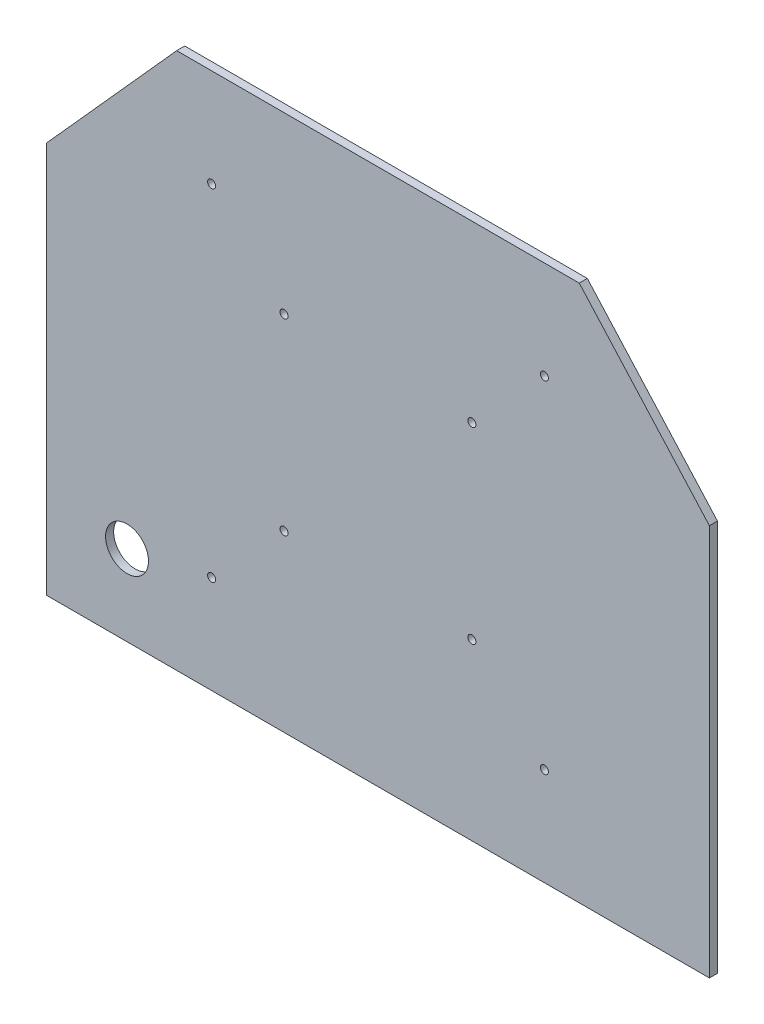
ISO-10303-21;
HEADER;
FILE_DESCRIPTION(('STEP AP214'),'2;1');
FILE_NAME('part.step','',(''),(''),'','','');
FILE_SCHEMA(('AUTOMOTIVE_DESIGN { 1 0 10303 214 1 1 1 1 }'));
ENDSEC;
DATA;
#1=APPLICATION_CONTEXT('core data for automotive mechanical design processes');
#2=APPLICATION_PROTOCOL_DEFINITION('international standard','automotive_design',2000,#1);
#3=PRODUCT_CONTEXT('',#1,'mechanical');
#4=PRODUCT('Part','Part','',(#3));
#5=PRODUCT_RELATED_PRODUCT_CATEGORY('part','',(#4));
#6=PRODUCT_DEFINITION_FORMATION('','',#4);
#7=PRODUCT_DEFINITION_CONTEXT('part definition',#1,'design');
#8=PRODUCT_DEFINITION('design','',#6,#7);
#9=PRODUCT_DEFINITION_SHAPE('','',#8);
#10=(LENGTH_UNIT() NAMED_UNIT(*) SI_UNIT(.MILLI.,.METRE.));
#11=(NAMED_UNIT(*) PLANE_ANGLE_UNIT() SI_UNIT($,.RADIAN.));
#12=(NAMED_UNIT(*) SI_UNIT($,.STERADIAN.) SOLID_ANGLE_UNIT());
#13=UNCERTAINTY_MEASURE_WITH_UNIT(LENGTH_MEASURE(1.E-05),#10,'distance_accuracy_value','');
#14=(GEOMETRIC_REPRESENTATION_CONTEXT(3) GLOBAL_UNCERTAINTY_ASSIGNED_CONTEXT((#13)) GLOBAL_UNIT_ASSIGNED_CONTEXT((#10,
#11,#12)) REPRESENTATION_CONTEXT('',''));
#15=CARTESIAN_POINT('',(0.,0.,0.));
#16=DIRECTION('',(0.,0.,1.));
#17=DIRECTION('',(1.,0.,0.));
#18=AXIS2_PLACEMENT_3D('',#15,#16,#17);
#19=CARTESIAN_POINT('',(280.2,0.,3.));
#20=DIRECTION('',(0.,1.,0.));
#21=DIRECTION('',(0.,0.,1.));
#22=AXIS2_PLACEMENT_3D('',#19,#20,#21);
#23=PLANE('',#22);
#24=DIRECTION('',(1.,0.,0.));
#25=VECTOR('',#24,1.);
#26=CARTESIAN_POINT('',(280.2,0.,0.));
#27=LINE('',#26,#25);
#28=CARTESIAN_POINT('',(16.5999999999984,2.22738494315422E-13,0.));
#29=VERTEX_POINT('',#28);
#30=CARTESIAN_POINT('',(263.600000000002,0.,0.));
#31=VERTEX_POINT('',#30);
#32=EDGE_CURVE('E97',#29,#31,#27,.T.);
#33=ORIENTED_EDGE('',*,*,#32,.T.);
#34=DIRECTION('',(0.,0.,-1.));
#35=VECTOR('',#34,1.);
#36=CARTESIAN_POINT('',(263.600000000002,2.22738494315422E-13,3.));
#37=LINE('',#36,#35);
#38=CARTESIAN_POINT('',(263.600000000002,2.22738494315422E-13,3.));
#39=VERTEX_POINT('',#38);
#40=EDGE_CURVE('E47',#39,#31,#37,.T.);
#41=ORIENTED_EDGE('',*,*,#40,.F.);
#42=DIRECTION('',(1.,0.,0.));
#43=VECTOR('',#42,1.);
#44=CARTESIAN_POINT('',(280.2,0.,3.));
#45=LINE('',#44,#43);
#46=CARTESIAN_POINT('',(16.5999999999984,2.22738494315422E-13,3.));
#47=VERTEX_POINT('',#46);
#48=EDGE_CURVE('E95',#47,#39,#45,.T.);
#49=ORIENTED_EDGE('',*,*,#48,.F.);
#50=DIRECTION('',(0.,0.,-1.));
#51=VECTOR('',#50,1.);
#52=CARTESIAN_POINT('',(16.5999999999984,2.22738494315422E-13,3.));
#53=LINE('',#52,#51);
#54=EDGE_CURVE('E140',#47,#29,#53,.T.);
#55=ORIENTED_EDGE('',*,*,#54,.T.);
#56=EDGE_LOOP('',(#33,#41,#49,#55));
#57=FACE_BOUND('',#56,.T.);
#58=ADVANCED_FACE('F33',(#57),#23,.F.);
#59=CARTESIAN_POINT('',(215.1,200.,3.));
#60=DIRECTION('',(-0.744288047549977,-0.667858744252288,0.));
#61=DIRECTION('',(0.667858744252288,-0.744288047549977,0.));
#62=AXIS2_PLACEMENT_3D('',#59,#60,#61);
#63=PLANE('',#62);
#64=DIRECTION('',(-0.667858744252288,0.744288047549977,0.));
#65=VECTOR('',#64,1.);
#66=CARTESIAN_POINT('',(215.1,200.,3.));
#67=LINE('',#66,#65);
#68=CARTESIAN_POINT('',(263.600000000002,145.949692780336,3.));
#69=VERTEX_POINT('',#68);
#70=CARTESIAN_POINT('',(215.1,200.,3.));
#71=VERTEX_POINT('',#70);
#72=EDGE_CURVE('E103',#69,#71,#67,.T.);
#73=ORIENTED_EDGE('',*,*,#72,.F.);
#74=DIRECTION('',(0.,0.,-1.));
#75=VECTOR('',#74,1.);
#76=CARTESIAN_POINT('',(263.600000000002,145.949692780336,3.));
#77=LINE('',#76,#75);
#78=CARTESIAN_POINT('',(263.600000000002,145.949692780336,0.));
#79=VERTEX_POINT('',#78);
#80=EDGE_CURVE('E85',#69,#79,#77,.T.);
#81=ORIENTED_EDGE('',*,*,#80,.T.);
#82=DIRECTION('',(-0.667858744252288,0.744288047549977,0.));
#83=VECTOR('',#82,1.);
#84=CARTESIAN_POINT('',(215.1,200.,0.));
#85=LINE('',#84,#83);
#86=CARTESIAN_POINT('',(215.1,200.,0.));
#87=VERTEX_POINT('',#86);
#88=EDGE_CURVE('E119',#79,#87,#85,.T.);
#89=ORIENTED_EDGE('',*,*,#88,.T.);
#90=DIRECTION('',(0.,0.,-1.));
#91=VECTOR('',#90,1.);
#92=CARTESIAN_POINT('',(215.1,200.,3.));
#93=LINE('',#92,#91);
#94=EDGE_CURVE('E40',#71,#87,#93,.T.);
#95=ORIENTED_EDGE('',*,*,#94,.F.);
#96=EDGE_LOOP('',(#73,#81,#89,#95));
#97=FACE_BOUND('',#96,.T.);
#98=ADVANCED_FACE('F138',(#97),#63,.F.);
#99=CARTESIAN_POINT('',(65.1,200.,3.));
#100=DIRECTION('',(0.,-1.,0.));
#101=DIRECTION('',(0.,0.,-1.));
#102=AXIS2_PLACEMENT_3D('',#99,#100,#101);
#103=PLANE('',#102);
#104=DIRECTION('',(-1.,0.,0.));
#105=VECTOR('',#104,1.);
#106=CARTESIAN_POINT('',(65.1,200.,0.));
#107=LINE('',#106,#105);
#108=CARTESIAN_POINT('',(65.1,200.,0.));
#109=VERTEX_POINT('',#108);
#110=EDGE_CURVE('E109',#87,#109,#107,.T.);
#111=ORIENTED_EDGE('',*,*,#110,.T.);
#112=DIRECTION('',(0.,0.,-1.));
#113=VECTOR('',#112,1.);
#114=CARTESIAN_POINT('',(65.1,200.,3.));
#115=LINE('',#114,#113);
#116=CARTESIAN_POINT('',(65.1,200.,3.));
#117=VERTEX_POINT('',#116);
#118=EDGE_CURVE('E117',#117,#109,#115,.T.);
#119=ORIENTED_EDGE('',*,*,#118,.F.);
#120=DIRECTION('',(-1.,0.,0.));
#121=VECTOR('',#120,1.);
#122=CARTESIAN_POINT('',(65.1,200.,3.));
#123=LINE('',#122,#121);
#124=EDGE_CURVE('E106',#71,#117,#123,.T.);
#125=ORIENTED_EDGE('',*,*,#124,.F.);
#126=ORIENTED_EDGE('',*,*,#94,.T.);
#127=EDGE_LOOP('',(#111,#119,#125,#126));
#128=FACE_BOUND('',#127,.T.);
#129=ADVANCED_FACE('F128',(#128),#103,.F.);
#130=CARTESIAN_POINT('',(0.,127.45,3.));
#131=DIRECTION('',(0.744288047549977,-0.667858744252288,0.));
#132=DIRECTION('',(0.667858744252288,0.744288047549977,0.));
#133=AXIS2_PLACEMENT_3D('',#130,#131,#132);
#134=PLANE('',#133);
#135=DIRECTION('',(-0.667858744252288,-0.744288047549977,0.));
#136=VECTOR('',#135,1.);
#137=CARTESIAN_POINT('',(0.,127.45,0.));
#138=LINE('',#137,#136);
#139=CARTESIAN_POINT('',(16.5999999999984,145.949692780336,0.));
#140=VERTEX_POINT('',#139);
#141=EDGE_CURVE('E104',#109,#140,#138,.T.);
#142=ORIENTED_EDGE('',*,*,#141,.T.);
#143=DIRECTION('',(0.,0.,1.));
#144=VECTOR('',#143,1.);
#145=CARTESIAN_POINT('',(16.5999999999984,145.949692780336,3.));
#146=LINE('',#145,#144);
#147=CARTESIAN_POINT('',(16.5999999999984,145.949692780336,3.));
#148=VERTEX_POINT('',#147);
#149=EDGE_CURVE('E54',#140,#148,#146,.T.);
#150=ORIENTED_EDGE('',*,*,#149,.T.);
#151=DIRECTION('',(-0.667858744252288,-0.744288047549977,0.));
#152=VECTOR('',#151,1.);
#153=CARTESIAN_POINT('',(0.,127.45,3.));
#154=LINE('',#153,#152);
#155=EDGE_CURVE('E115',#117,#148,#154,.T.);
#156=ORIENTED_EDGE('',*,*,#155,.F.);
#157=ORIENTED_EDGE('',*,*,#118,.T.);
#158=EDGE_LOOP('',(#142,#150,#156,#157));
#159=FACE_BOUND('',#158,.T.);
#160=ADVANCED_FACE('F136',(#159),#134,.F.);
#161=CARTESIAN_POINT('',(0.,0.,3.));
#162=DIRECTION('',(0.,0.,-1.));
#163=DIRECTION('',(-1.,0.,0.));
#164=AXIS2_PLACEMENT_3D('',#161,#162,#163);
#165=PLANE('',#164);
#166=CARTESIAN_POINT('',(105.1,135.,3.));
#167=DIRECTION('',(0.,0.,1.));
#168=DIRECTION('',(1.,0.,0.));
#169=AXIS2_PLACEMENT_3D('',#166,#167,#168);
#170=CIRCLE('',#169,1.5);
#171=CARTESIAN_POINT('',(106.6,135.,3.));
#172=VERTEX_POINT('',#171);
#173=EDGE_CURVE('E193',#172,#172,#170,.T.);
#174=ORIENTED_EDGE('',*,*,#173,.F.);
#175=EDGE_LOOP('',(#174));
#176=FACE_BOUND('',#175,.T.);
#177=CARTESIAN_POINT('',(175.1,135.,3.));
#178=DIRECTION('',(0.,0.,1.));
#179=DIRECTION('',(1.,0.,0.));
#180=AXIS2_PLACEMENT_3D('',#177,#178,#179);
#181=CIRCLE('',#180,1.5);
#182=CARTESIAN_POINT('',(176.6,135.,3.));
#183=VERTEX_POINT('',#182);
#184=EDGE_CURVE('E187',#183,#183,#181,.T.);
#185=ORIENTED_EDGE('',*,*,#184,.F.);
#186=EDGE_LOOP('',(#185));
#187=FACE_BOUND('',#186,.T.);
#188=CARTESIAN_POINT('',(175.1,65.,3.));
#189=DIRECTION('',(0.,0.,1.));
#190=DIRECTION('',(1.,0.,0.));
#191=AXIS2_PLACEMENT_3D('',#188,#189,#190);
#192=CIRCLE('',#191,1.5);
#193=CARTESIAN_POINT('',(176.6,65.,3.));
#194=VERTEX_POINT('',#193);
#195=EDGE_CURVE('E181',#194,#194,#192,.T.);
#196=ORIENTED_EDGE('',*,*,#195,.F.);
#197=EDGE_LOOP('',(#196));
#198=FACE_BOUND('',#197,.T.);
#199=CARTESIAN_POINT('',(105.1,65.,3.));
#200=DIRECTION('',(0.,0.,1.));
#201=DIRECTION('',(1.,0.,0.));
#202=AXIS2_PLACEMENT_3D('',#199,#200,#201);
#203=CIRCLE('',#202,1.5);
#204=CARTESIAN_POINT('',(106.6,65.,3.));
#205=VERTEX_POINT('',#204);
#206=EDGE_CURVE('E175',#205,#205,#203,.T.);
#207=ORIENTED_EDGE('',*,*,#206,.F.);
#208=EDGE_LOOP('',(#207));
#209=FACE_BOUND('',#208,.T.);
#210=CARTESIAN_POINT('',(46.5999999999984,30.0000000000002,3.));
#211=DIRECTION('',(0.,0.,1.));
#212=DIRECTION('',(1.,0.,0.));
#213=AXIS2_PLACEMENT_3D('',#210,#211,#212);
#214=CIRCLE('',#213,8.00000000000001);
#215=CARTESIAN_POINT('',(54.5999999999984,30.0000000000002,3.));
#216=VERTEX_POINT('',#215);
#217=EDGE_CURVE('E169',#216,#216,#214,.T.);
#218=ORIENTED_EDGE('',*,*,#217,.F.);
#219=EDGE_LOOP('',(#218));
#220=FACE_BOUND('',#219,.T.);
#221=CARTESIAN_POINT('',(78.1,36.5,3.));
#222=DIRECTION('',(0.,0.,1.));
#223=DIRECTION('',(1.,0.,0.));
#224=AXIS2_PLACEMENT_3D('',#221,#222,#223);
#225=CIRCLE('',#224,1.5);
#226=CARTESIAN_POINT('',(79.6,36.5,3.));
#227=VERTEX_POINT('',#226);
#228=EDGE_CURVE('E164',#227,#227,#225,.T.);
#229=ORIENTED_EDGE('',*,*,#228,.F.);
#230=EDGE_LOOP('',(#229));
#231=FACE_BOUND('',#230,.T.);
#232=CARTESIAN_POINT('',(202.1,36.5,3.));
#233=DIRECTION('',(0.,0.,1.));
#234=DIRECTION('',(-1.,0.,0.));
#235=AXIS2_PLACEMENT_3D('',#232,#233,#234);
#236=CIRCLE('',#235,1.5);
#237=CARTESIAN_POINT('',(200.6,36.5,3.));
#238=VERTEX_POINT('',#237);
#239=EDGE_CURVE('E158',#238,#238,#236,.T.);
#240=ORIENTED_EDGE('',*,*,#239,.F.);
#241=EDGE_LOOP('',(#240));
#242=FACE_BOUND('',#241,.T.);
#243=CARTESIAN_POINT('',(202.1,163.5,3.));
#244=DIRECTION('',(0.,0.,1.));
#245=DIRECTION('',(-1.,0.,0.));
#246=AXIS2_PLACEMENT_3D('',#243,#244,#245);
#247=CIRCLE('',#246,1.5);
#248=CARTESIAN_POINT('',(200.6,163.5,3.));
#249=VERTEX_POINT('',#248);
#250=EDGE_CURVE('E151',#249,#249,#247,.T.);
#251=ORIENTED_EDGE('',*,*,#250,.F.);
#252=EDGE_LOOP('',(#251));
#253=FACE_BOUND('',#252,.T.);
#254=CARTESIAN_POINT('',(78.1,163.5,3.));
#255=DIRECTION('',(0.,0.,1.));
#256=DIRECTION('',(1.,0.,0.));
#257=AXIS2_PLACEMENT_3D('',#254,#255,#256);
#258=CIRCLE('',#257,1.5);
#259=CARTESIAN_POINT('',(79.6,163.5,3.));
#260=VERTEX_POINT('',#259);
#261=EDGE_CURVE('E145',#260,#260,#258,.T.);
#262=ORIENTED_EDGE('',*,*,#261,.F.);
#263=EDGE_LOOP('',(#262));
#264=FACE_BOUND('',#263,.T.);
#265=ORIENTED_EDGE('',*,*,#48,.T.);
#266=DIRECTION('',(0.,1.,0.));
#267=VECTOR('',#266,1.);
#268=CARTESIAN_POINT('',(263.600000000002,2.22738494315422E-13,3.));
#269=LINE('',#268,#267);
#270=EDGE_CURVE('E82',#39,#69,#269,.T.);
#271=ORIENTED_EDGE('',*,*,#270,.T.);
#272=ORIENTED_EDGE('',*,*,#72,.T.);
#273=ORIENTED_EDGE('',*,*,#124,.T.);
#274=ORIENTED_EDGE('',*,*,#155,.T.);
#275=DIRECTION('',(0.,-1.,0.));
#276=VECTOR('',#275,1.);
#277=CARTESIAN_POINT('',(16.5999999999984,2.22738494315422E-13,3.));
#278=LINE('',#277,#276);
#279=EDGE_CURVE('E102',#148,#47,#278,.T.);
#280=ORIENTED_EDGE('',*,*,#279,.T.);
#281=EDGE_LOOP('',(#265,#271,#272,#273,#274,#280));
#282=FACE_BOUND('',#281,.T.);
#283=ADVANCED_FACE('F100',(#176,#187,#198,#209,#220,#231,#242,#253,#264,#282),#165,.F.);
#284=CARTESIAN_POINT('',(0.,0.,0.));
#285=DIRECTION('',(0.,0.,-1.));
#286=DIRECTION('',(-1.,0.,0.));
#287=AXIS2_PLACEMENT_3D('',#284,#285,#286);
#288=PLANE('',#287);
#289=CARTESIAN_POINT('',(105.1,135.,0.));
#290=DIRECTION('',(0.,0.,1.));
#291=DIRECTION('',(1.,0.,0.));
#292=AXIS2_PLACEMENT_3D('',#289,#290,#291);
#293=CIRCLE('',#292,1.5);
#294=CARTESIAN_POINT('',(106.6,135.,0.));
#295=VERTEX_POINT('',#294);
#296=EDGE_CURVE('E178',#295,#295,#293,.T.);
#297=ORIENTED_EDGE('',*,*,#296,.T.);
#298=EDGE_LOOP('',(#297));
#299=FACE_BOUND('',#298,.T.);
#300=CARTESIAN_POINT('',(175.1,135.,0.));
#301=DIRECTION('',(0.,0.,1.));
#302=DIRECTION('',(1.,0.,0.));
#303=AXIS2_PLACEMENT_3D('',#300,#301,#302);
#304=CIRCLE('',#303,1.5);
#305=CARTESIAN_POINT('',(176.6,135.,0.));
#306=VERTEX_POINT('',#305);
#307=EDGE_CURVE('E190',#306,#306,#304,.T.);
#308=ORIENTED_EDGE('',*,*,#307,.T.);
#309=EDGE_LOOP('',(#308));
#310=FACE_BOUND('',#309,.T.);
#311=CARTESIAN_POINT('',(175.1,65.,0.));
#312=DIRECTION('',(0.,0.,1.));
#313=DIRECTION('',(1.,0.,0.));
#314=AXIS2_PLACEMENT_3D('',#311,#312,#313);
#315=CIRCLE('',#314,1.5);
#316=CARTESIAN_POINT('',(176.6,65.,0.));
#317=VERTEX_POINT('',#316);
#318=EDGE_CURVE('E184',#317,#317,#315,.T.);
#319=ORIENTED_EDGE('',*,*,#318,.T.);
#320=EDGE_LOOP('',(#319));
#321=FACE_BOUND('',#320,.T.);
#322=CARTESIAN_POINT('',(105.1,65.,0.));
#323=DIRECTION('',(0.,0.,1.));
#324=DIRECTION('',(1.,0.,0.));
#325=AXIS2_PLACEMENT_3D('',#322,#323,#324);
#326=CIRCLE('',#325,1.5);
#327=CARTESIAN_POINT('',(106.6,65.,0.));
#328=VERTEX_POINT('',#327);
#329=EDGE_CURVE('E172',#328,#328,#326,.T.);
#330=ORIENTED_EDGE('',*,*,#329,.T.);
#331=EDGE_LOOP('',(#330));
#332=FACE_BOUND('',#331,.T.);
#333=CARTESIAN_POINT('',(46.5999999999984,30.0000000000002,0.));
#334=DIRECTION('',(0.,0.,1.));
#335=DIRECTION('',(1.,0.,0.));
#336=AXIS2_PLACEMENT_3D('',#333,#334,#335);
#337=CIRCLE('',#336,8.00000000000001);
#338=CARTESIAN_POINT('',(54.5999999999984,30.0000000000002,0.));
#339=VERTEX_POINT('',#338);
#340=EDGE_CURVE('E155',#339,#339,#337,.T.);
#341=ORIENTED_EDGE('',*,*,#340,.T.);
#342=EDGE_LOOP('',(#341));
#343=FACE_BOUND('',#342,.T.);
#344=CARTESIAN_POINT('',(78.1,36.5,0.));
#345=DIRECTION('',(0.,0.,1.));
#346=DIRECTION('',(1.,0.,0.));
#347=AXIS2_PLACEMENT_3D('',#344,#345,#346);
#348=CIRCLE('',#347,1.5);
#349=CARTESIAN_POINT('',(79.6,36.5,0.));
#350=VERTEX_POINT('',#349);
#351=EDGE_CURVE('E149',#350,#350,#348,.T.);
#352=ORIENTED_EDGE('',*,*,#351,.T.);
#353=EDGE_LOOP('',(#352));
#354=FACE_BOUND('',#353,.T.);
#355=CARTESIAN_POINT('',(202.1,36.5,0.));
#356=DIRECTION('',(0.,0.,1.));
#357=DIRECTION('',(-1.,0.,0.));
#358=AXIS2_PLACEMENT_3D('',#355,#356,#357);
#359=CIRCLE('',#358,1.5);
#360=CARTESIAN_POINT('',(200.6,36.5,0.));
#361=VERTEX_POINT('',#360);
#362=EDGE_CURVE('E161',#361,#361,#359,.T.);
#363=ORIENTED_EDGE('',*,*,#362,.T.);
#364=EDGE_LOOP('',(#363));
#365=FACE_BOUND('',#364,.T.);
#366=CARTESIAN_POINT('',(202.1,163.5,0.));
#367=DIRECTION('',(0.,0.,1.));
#368=DIRECTION('',(-1.,0.,0.));
#369=AXIS2_PLACEMENT_3D('',#366,#367,#368);
#370=CIRCLE('',#369,1.5);
#371=CARTESIAN_POINT('',(200.6,163.5,0.));
#372=VERTEX_POINT('',#371);
#373=EDGE_CURVE('E154',#372,#372,#370,.T.);
#374=ORIENTED_EDGE('',*,*,#373,.T.);
#375=EDGE_LOOP('',(#374));
#376=FACE_BOUND('',#375,.T.);
#377=CARTESIAN_POINT('',(78.1,163.5,0.));
#378=DIRECTION('',(0.,0.,1.));
#379=DIRECTION('',(1.,0.,0.));
#380=AXIS2_PLACEMENT_3D('',#377,#378,#379);
#381=CIRCLE('',#380,1.5);
#382=CARTESIAN_POINT('',(79.6,163.5,0.));
#383=VERTEX_POINT('',#382);
#384=EDGE_CURVE('E143',#383,#383,#381,.T.);
#385=ORIENTED_EDGE('',*,*,#384,.T.);
#386=EDGE_LOOP('',(#385));
#387=FACE_BOUND('',#386,.T.);
#388=DIRECTION('',(0.,1.,0.));
#389=VECTOR('',#388,1.);
#390=CARTESIAN_POINT('',(263.600000000002,2.22738494315422E-13,0.));
#391=LINE('',#390,#389);
#392=EDGE_CURVE('E89',#31,#79,#391,.T.);
#393=ORIENTED_EDGE('',*,*,#392,.F.);
#394=ORIENTED_EDGE('',*,*,#32,.F.);
#395=DIRECTION('',(0.,-1.,0.));
#396=VECTOR('',#395,1.);
#397=CARTESIAN_POINT('',(16.5999999999984,0.,0.));
#398=LINE('',#397,#396);
#399=EDGE_CURVE('E11',#140,#29,#398,.T.);
#400=ORIENTED_EDGE('',*,*,#399,.F.);
#401=ORIENTED_EDGE('',*,*,#141,.F.);
#402=ORIENTED_EDGE('',*,*,#110,.F.);
#403=ORIENTED_EDGE('',*,*,#88,.F.);
#404=EDGE_LOOP('',(#393,#394,#400,#401,#402,#403));
#405=FACE_BOUND('',#404,.T.);
#406=ADVANCED_FACE('F134',(#299,#310,#321,#332,#343,#354,#365,#376,#387,#405),#288,.T.);
#407=CARTESIAN_POINT('',(16.5999999999984,2.22738494315422E-13,3.));
#408=DIRECTION('',(1.,0.,0.));
#409=DIRECTION('',(0.,1.,0.));
#410=AXIS2_PLACEMENT_3D('',#407,#408,#409);
#411=PLANE('',#410);
#412=ORIENTED_EDGE('',*,*,#399,.T.);
#413=ORIENTED_EDGE('',*,*,#54,.F.);
#414=ORIENTED_EDGE('',*,*,#279,.F.);
#415=ORIENTED_EDGE('',*,*,#149,.F.);
#416=EDGE_LOOP('',(#412,#413,#414,#415));
#417=FACE_BOUND('',#416,.T.);
#418=ADVANCED_FACE('F239',(#417),#411,.F.);
#419=CARTESIAN_POINT('',(263.600000000002,2.22738494315422E-13,3.));
#420=DIRECTION('',(-1.,0.,0.));
#421=DIRECTION('',(0.,0.,1.));
#422=AXIS2_PLACEMENT_3D('',#419,#420,#421);
#423=PLANE('',#422);
#424=ORIENTED_EDGE('',*,*,#270,.F.);
#425=ORIENTED_EDGE('',*,*,#40,.T.);
#426=ORIENTED_EDGE('',*,*,#392,.T.);
#427=ORIENTED_EDGE('',*,*,#80,.F.);
#428=EDGE_LOOP('',(#424,#425,#426,#427));
#429=FACE_BOUND('',#428,.T.);
#430=ADVANCED_FACE('F83',(#429),#423,.F.);
#431=CARTESIAN_POINT('',(78.1,163.5,0.));
#432=DIRECTION('',(0.,0.,1.));
#433=DIRECTION('',(1.,0.,0.));
#434=AXIS2_PLACEMENT_3D('',#431,#432,#433);
#435=CYLINDRICAL_SURFACE('',#434,1.5);
#436=ORIENTED_EDGE('',*,*,#384,.F.);
#437=EDGE_LOOP('',(#436));
#438=FACE_BOUND('',#437,.T.);
#439=ORIENTED_EDGE('',*,*,#261,.T.);
#440=EDGE_LOOP('',(#439));
#441=FACE_BOUND('',#440,.T.);
#442=ADVANCED_FACE('F227',(#438,#441),#435,.F.);
#443=CARTESIAN_POINT('',(202.1,163.5,0.));
#444=DIRECTION('',(0.,0.,1.));
#445=DIRECTION('',(1.,0.,0.));
#446=AXIS2_PLACEMENT_3D('',#443,#444,#445);
#447=CYLINDRICAL_SURFACE('',#446,1.5);
#448=ORIENTED_EDGE('',*,*,#373,.F.);
#449=EDGE_LOOP('',(#448));
#450=FACE_BOUND('',#449,.T.);
#451=ORIENTED_EDGE('',*,*,#250,.T.);
#452=EDGE_LOOP('',(#451));
#453=FACE_BOUND('',#452,.T.);
#454=ADVANCED_FACE('F229',(#450,#453),#447,.F.);
#455=CARTESIAN_POINT('',(202.1,36.5,0.));
#456=DIRECTION('',(0.,0.,1.));
#457=DIRECTION('',(1.,0.,0.));
#458=AXIS2_PLACEMENT_3D('',#455,#456,#457);
#459=CYLINDRICAL_SURFACE('',#458,1.5);
#460=ORIENTED_EDGE('',*,*,#362,.F.);
#461=EDGE_LOOP('',(#460));
#462=FACE_BOUND('',#461,.T.);
#463=ORIENTED_EDGE('',*,*,#239,.T.);
#464=EDGE_LOOP('',(#463));
#465=FACE_BOUND('',#464,.T.);
#466=ADVANCED_FACE('F236',(#462,#465),#459,.F.);
#467=CARTESIAN_POINT('',(78.1,36.5,0.));
#468=DIRECTION('',(0.,0.,1.));
#469=DIRECTION('',(1.,0.,0.));
#470=AXIS2_PLACEMENT_3D('',#467,#468,#469);
#471=CYLINDRICAL_SURFACE('',#470,1.5);
#472=ORIENTED_EDGE('',*,*,#351,.F.);
#473=EDGE_LOOP('',(#472));
#474=FACE_BOUND('',#473,.T.);
#475=ORIENTED_EDGE('',*,*,#228,.T.);
#476=EDGE_LOOP('',(#475));
#477=FACE_BOUND('',#476,.T.);
#478=ADVANCED_FACE('F286',(#474,#477),#471,.F.);
#479=CARTESIAN_POINT('',(46.5999999999984,30.0000000000002,0.));
#480=DIRECTION('',(0.,0.,1.));
#481=DIRECTION('',(1.,0.,0.));
#482=AXIS2_PLACEMENT_3D('',#479,#480,#481);
#483=CYLINDRICAL_SURFACE('',#482,8.00000000000001);
#484=ORIENTED_EDGE('',*,*,#340,.F.);
#485=EDGE_LOOP('',(#484));
#486=FACE_BOUND('',#485,.T.);
#487=ORIENTED_EDGE('',*,*,#217,.T.);
#488=EDGE_LOOP('',(#487));
#489=FACE_BOUND('',#488,.T.);
#490=ADVANCED_FACE('F296',(#486,#489),#483,.F.);
#491=CARTESIAN_POINT('',(105.1,65.,0.));
#492=DIRECTION('',(0.,0.,1.));
#493=DIRECTION('',(1.,0.,0.));
#494=AXIS2_PLACEMENT_3D('',#491,#492,#493);
#495=CYLINDRICAL_SURFACE('',#494,1.5);
#496=ORIENTED_EDGE('',*,*,#329,.F.);
#497=EDGE_LOOP('',(#496));
#498=FACE_BOUND('',#497,.T.);
#499=ORIENTED_EDGE('',*,*,#206,.T.);
#500=EDGE_LOOP('',(#499));
#501=FACE_BOUND('',#500,.T.);
#502=ADVANCED_FACE('F305',(#498,#501),#495,.F.);
#503=CARTESIAN_POINT('',(175.1,65.,0.));
#504=DIRECTION('',(0.,0.,1.));
#505=DIRECTION('',(1.,0.,0.));
#506=AXIS2_PLACEMENT_3D('',#503,#504,#505);
#507=CYLINDRICAL_SURFACE('',#506,1.5);
#508=ORIENTED_EDGE('',*,*,#318,.F.);
#509=EDGE_LOOP('',(#508));
#510=FACE_BOUND('',#509,.T.);
#511=ORIENTED_EDGE('',*,*,#195,.T.);
#512=EDGE_LOOP('',(#511));
#513=FACE_BOUND('',#512,.T.);
#514=ADVANCED_FACE('F321',(#510,#513),#507,.F.);
#515=CARTESIAN_POINT('',(175.1,135.,0.));
#516=DIRECTION('',(0.,0.,1.));
#517=DIRECTION('',(1.,0.,0.));
#518=AXIS2_PLACEMENT_3D('',#515,#516,#517);
#519=CYLINDRICAL_SURFACE('',#518,1.5);
#520=ORIENTED_EDGE('',*,*,#307,.F.);
#521=EDGE_LOOP('',(#520));
#522=FACE_BOUND('',#521,.T.);
#523=ORIENTED_EDGE('',*,*,#184,.T.);
#524=EDGE_LOOP('',(#523));
#525=FACE_BOUND('',#524,.T.);
#526=ADVANCED_FACE('F204',(#522,#525),#519,.F.);
#527=CARTESIAN_POINT('',(105.1,135.,0.));
#528=DIRECTION('',(0.,0.,1.));
#529=DIRECTION('',(1.,0.,0.));
#530=AXIS2_PLACEMENT_3D('',#527,#528,#529);
#531=CYLINDRICAL_SURFACE('',#530,1.5);
#532=ORIENTED_EDGE('',*,*,#296,.F.);
#533=EDGE_LOOP('',(#532));
#534=FACE_BOUND('',#533,.T.);
#535=ORIENTED_EDGE('',*,*,#173,.T.);
#536=EDGE_LOOP('',(#535));
#537=FACE_BOUND('',#536,.T.);
#538=ADVANCED_FACE('F201',(#534,#537),#531,.F.);
#539=CLOSED_SHELL('',(#58,#98,#129,#160,#283,#406,#418,#430,#442,#454,#466,#478,#490,#502,#514,
#526,#538));
#540=MANIFOLD_SOLID_BREP('B2',#539);
#541=ADVANCED_BREP_SHAPE_REPRESENTATION('',(#18,#540),#14);
#542=SHAPE_DEFINITION_REPRESENTATION(#9,#541);
ENDSEC;
END-ISO-10303-21;
